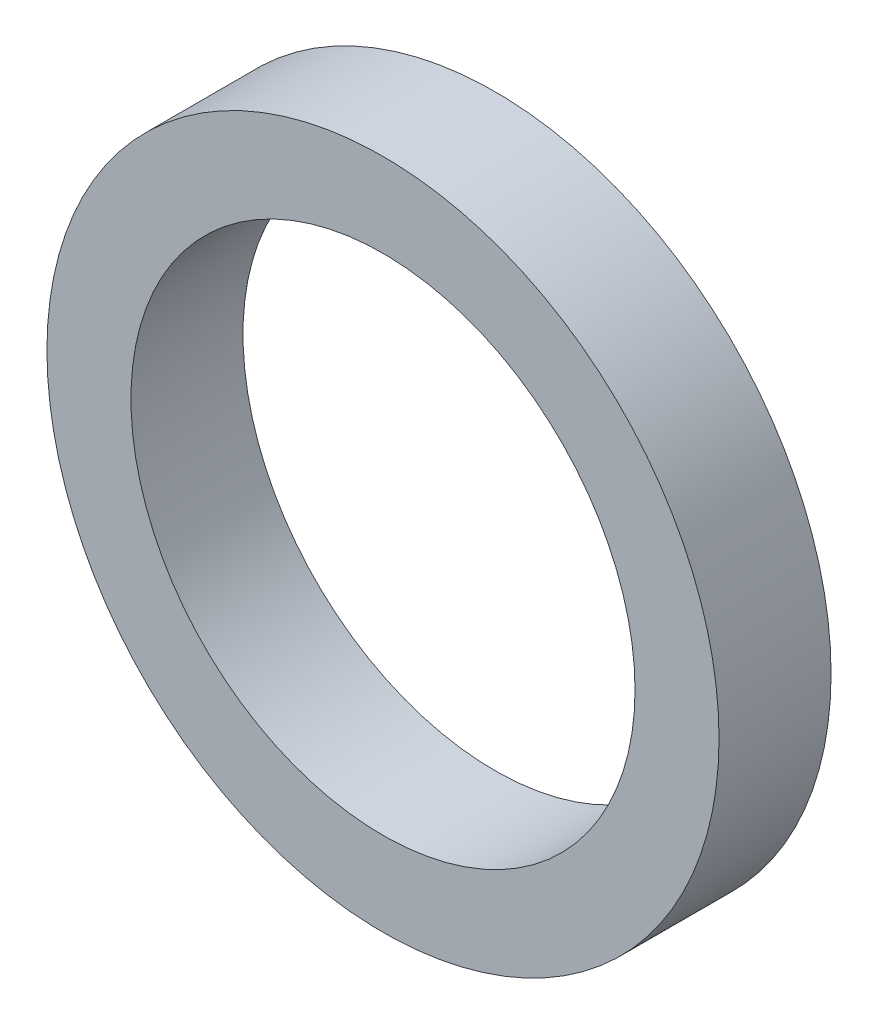
ISO-10303-21;
HEADER;
FILE_DESCRIPTION(('STEP AP214'),'2;1');
FILE_NAME('part.step','',(''),(''),'','','');
FILE_SCHEMA(('AUTOMOTIVE_DESIGN { 1 0 10303 214 1 1 1 1 }'));
ENDSEC;
DATA;
#1=APPLICATION_CONTEXT('core data for automotive mechanical design processes');
#2=APPLICATION_PROTOCOL_DEFINITION('international standard','automotive_design',2000,#1);
#3=PRODUCT_CONTEXT('',#1,'mechanical');
#4=PRODUCT('Part','Part','',(#3));
#5=PRODUCT_RELATED_PRODUCT_CATEGORY('part','',(#4));
#6=PRODUCT_DEFINITION_FORMATION('','',#4);
#7=PRODUCT_DEFINITION_CONTEXT('part definition',#1,'design');
#8=PRODUCT_DEFINITION('design','',#6,#7);
#9=PRODUCT_DEFINITION_SHAPE('','',#8);
#10=(LENGTH_UNIT() NAMED_UNIT(*) SI_UNIT(.MILLI.,.METRE.));
#11=(NAMED_UNIT(*) PLANE_ANGLE_UNIT() SI_UNIT($,.RADIAN.));
#12=(NAMED_UNIT(*) SI_UNIT($,.STERADIAN.) SOLID_ANGLE_UNIT());
#13=UNCERTAINTY_MEASURE_WITH_UNIT(LENGTH_MEASURE(1.E-05),#10,'distance_accuracy_value','');
#14=(GEOMETRIC_REPRESENTATION_CONTEXT(3) GLOBAL_UNCERTAINTY_ASSIGNED_CONTEXT((#13)) GLOBAL_UNIT_ASSIGNED_CONTEXT((#10,
#11,#12)) REPRESENTATION_CONTEXT('',''));
#15=CARTESIAN_POINT('',(0.,0.,0.));
#16=DIRECTION('',(0.,0.,1.));
#17=DIRECTION('',(1.,0.,0.));
#18=AXIS2_PLACEMENT_3D('',#15,#16,#17);
#19=CARTESIAN_POINT('',(0.,0.,10.));
#20=DIRECTION('',(0.,0.,1.));
#21=DIRECTION('',(1.,0.,0.));
#22=AXIS2_PLACEMENT_3D('',#19,#20,#21);
#23=PLANE('',#22);
#24=CARTESIAN_POINT('',(0.,0.,10.));
#25=DIRECTION('',(0.,0.,1.));
#26=DIRECTION('',(1.,0.,0.));
#27=AXIS2_PLACEMENT_3D('',#24,#25,#26);
#28=CIRCLE('',#27,30.);
#29=CARTESIAN_POINT('',(30.,0.,10.));
#30=VERTEX_POINT('',#29);
#31=EDGE_CURVE('E10',#30,#30,#28,.T.);
#32=ORIENTED_EDGE('',*,*,#31,.T.);
#33=EDGE_LOOP('',(#32));
#34=FACE_BOUND('',#33,.T.);
#35=CARTESIAN_POINT('',(0.,0.,10.));
#36=DIRECTION('',(0.,0.,1.));
#37=DIRECTION('',(1.,0.,0.));
#38=AXIS2_PLACEMENT_3D('',#35,#36,#37);
#39=CIRCLE('',#38,22.5);
#40=CARTESIAN_POINT('',(22.5,0.,10.));
#41=VERTEX_POINT('',#40);
#42=EDGE_CURVE('E56',#41,#41,#39,.T.);
#43=ORIENTED_EDGE('',*,*,#42,.F.);
#44=EDGE_LOOP('',(#43));
#45=FACE_BOUND('',#44,.T.);
#46=ADVANCED_FACE('F43',(#34,#45),#23,.T.);
#47=CARTESIAN_POINT('',(0.,0.,0.));
#48=DIRECTION('',(0.,0.,1.));
#49=DIRECTION('',(1.,0.,0.));
#50=AXIS2_PLACEMENT_3D('',#47,#48,#49);
#51=PLANE('',#50);
#52=CARTESIAN_POINT('',(0.,0.,0.));
#53=DIRECTION('',(0.,0.,1.));
#54=DIRECTION('',(1.,0.,0.));
#55=AXIS2_PLACEMENT_3D('',#52,#53,#54);
#56=CIRCLE('',#55,30.);
#57=CARTESIAN_POINT('',(30.,0.,0.));
#58=VERTEX_POINT('',#57);
#59=EDGE_CURVE('E47',#58,#58,#56,.T.);
#60=ORIENTED_EDGE('',*,*,#59,.F.);
#61=EDGE_LOOP('',(#60));
#62=FACE_BOUND('',#61,.T.);
#63=CARTESIAN_POINT('',(0.,0.,0.));
#64=DIRECTION('',(0.,0.,1.));
#65=DIRECTION('',(1.,0.,0.));
#66=AXIS2_PLACEMENT_3D('',#63,#64,#65);
#67=CIRCLE('',#66,22.5);
#68=CARTESIAN_POINT('',(22.5,0.,0.));
#69=VERTEX_POINT('',#68);
#70=EDGE_CURVE('E58',#69,#69,#67,.T.);
#71=ORIENTED_EDGE('',*,*,#70,.T.);
#72=EDGE_LOOP('',(#71));
#73=FACE_BOUND('',#72,.T.);
#74=ADVANCED_FACE('F70',(#62,#73),#51,.F.);
#75=CARTESIAN_POINT('',(0.,0.,10.));
#76=DIRECTION('',(0.,0.,-1.));
#77=DIRECTION('',(-1.,0.,0.));
#78=AXIS2_PLACEMENT_3D('',#75,#76,#77);
#79=CYLINDRICAL_SURFACE('',#78,30.);
#80=ORIENTED_EDGE('',*,*,#31,.F.);
#81=EDGE_LOOP('',(#80));
#82=FACE_BOUND('',#81,.T.);
#83=ORIENTED_EDGE('',*,*,#59,.T.);
#84=EDGE_LOOP('',(#83));
#85=FACE_BOUND('',#84,.T.);
#86=ADVANCED_FACE('F45',(#82,#85),#79,.T.);
#87=CARTESIAN_POINT('',(0.,0.,10.));
#88=DIRECTION('',(0.,0.,-1.));
#89=DIRECTION('',(-1.,0.,0.));
#90=AXIS2_PLACEMENT_3D('',#87,#88,#89);
#91=CYLINDRICAL_SURFACE('',#90,22.5);
#92=ORIENTED_EDGE('',*,*,#42,.T.);
#93=EDGE_LOOP('',(#92));
#94=FACE_BOUND('',#93,.T.);
#95=ORIENTED_EDGE('',*,*,#70,.F.);
#96=EDGE_LOOP('',(#95));
#97=FACE_BOUND('',#96,.T.);
#98=ADVANCED_FACE('F66',(#94,#97),#91,.F.);
#99=CLOSED_SHELL('',(#46,#74,#86,#98));
#100=MANIFOLD_SOLID_BREP('B2',#99);
#101=ADVANCED_BREP_SHAPE_REPRESENTATION('',(#18,#100),#14);
#102=SHAPE_DEFINITION_REPRESENTATION(#9,#101);
ENDSEC;
END-ISO-10303-21;
